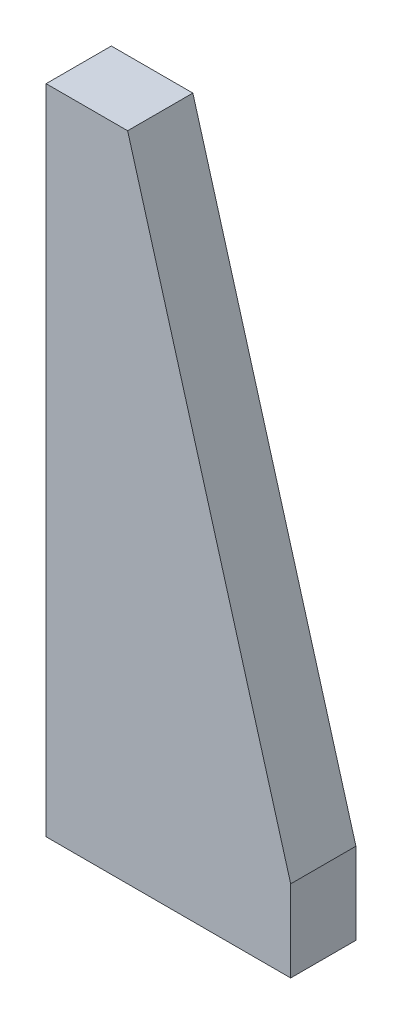
ISO-10303-21;
HEADER;
FILE_DESCRIPTION(('STEP AP214'),'2;1');
FILE_NAME('part.step','',(''),(''),'','','');
FILE_SCHEMA(('AUTOMOTIVE_DESIGN { 1 0 10303 214 1 1 1 1 }'));
ENDSEC;
DATA;
#1=APPLICATION_CONTEXT('core data for automotive mechanical design processes');
#2=APPLICATION_PROTOCOL_DEFINITION('international standard','automotive_design',2000,#1);
#3=PRODUCT_CONTEXT('',#1,'mechanical');
#4=PRODUCT('Part','Part','',(#3));
#5=PRODUCT_RELATED_PRODUCT_CATEGORY('part','',(#4));
#6=PRODUCT_DEFINITION_FORMATION('','',#4);
#7=PRODUCT_DEFINITION_CONTEXT('part definition',#1,'design');
#8=PRODUCT_DEFINITION('design','',#6,#7);
#9=PRODUCT_DEFINITION_SHAPE('','',#8);
#10=(LENGTH_UNIT() NAMED_UNIT(*) SI_UNIT(.MILLI.,.METRE.));
#11=(NAMED_UNIT(*) PLANE_ANGLE_UNIT() SI_UNIT($,.RADIAN.));
#12=(NAMED_UNIT(*) SI_UNIT($,.STERADIAN.) SOLID_ANGLE_UNIT());
#13=UNCERTAINTY_MEASURE_WITH_UNIT(LENGTH_MEASURE(1.E-05),#10,'distance_accuracy_value','');
#14=(GEOMETRIC_REPRESENTATION_CONTEXT(3) GLOBAL_UNCERTAINTY_ASSIGNED_CONTEXT((#13)) GLOBAL_UNIT_ASSIGNED_CONTEXT((#10,
#11,#12)) REPRESENTATION_CONTEXT('',''));
#15=CARTESIAN_POINT('',(0.,0.,0.));
#16=DIRECTION('',(0.,0.,1.));
#17=DIRECTION('',(1.,0.,0.));
#18=AXIS2_PLACEMENT_3D('',#15,#16,#17);
#19=CARTESIAN_POINT('',(22.,0.,0.));
#20=DIRECTION('',(0.,-1.,0.));
#21=DIRECTION('',(0.,0.,-1.));
#22=AXIS2_PLACEMENT_3D('',#19,#20,#21);
#23=CYLINDRICAL_SURFACE('',#22,1.65);
#24=DIRECTION('',(0.,-1.,0.));
#25=VECTOR('',#24,1.);
#26=CARTESIAN_POINT('',(22.,0.,1.65));
#27=LINE('',#26,#25);
#28=CARTESIAN_POINT('',(22.,10.1,1.65));
#29=VERTEX_POINT('',#28);
#30=CARTESIAN_POINT('',(22.,0.,1.65));
#31=VERTEX_POINT('',#30);
#32=EDGE_CURVE('E223',#29,#31,#27,.T.);
#33=ORIENTED_EDGE('',*,*,#32,.F.);
#34=CARTESIAN_POINT('',(22.,10.1,0.));
#35=DIRECTION('',(0.,-1.,0.));
#36=DIRECTION('',(0.,0.,-1.));
#37=AXIS2_PLACEMENT_3D('',#34,#35,#36);
#38=CIRCLE('',#37,1.65);
#39=CARTESIAN_POINT('',(22.,10.1,-1.65));
#40=VERTEX_POINT('',#39);
#41=EDGE_CURVE('E11',#40,#29,#38,.T.);
#42=ORIENTED_EDGE('',*,*,#41,.F.);
#43=DIRECTION('',(0.,-1.,0.));
#44=VECTOR('',#43,1.);
#45=CARTESIAN_POINT('',(22.,0.,-1.65));
#46=LINE('',#45,#44);
#47=CARTESIAN_POINT('',(22.,0.,-1.65));
#48=VERTEX_POINT('',#47);
#49=EDGE_CURVE('E212',#40,#48,#46,.T.);
#50=ORIENTED_EDGE('',*,*,#49,.T.);
#51=CARTESIAN_POINT('',(22.,0.,0.));
#52=DIRECTION('',(0.,-1.,0.));
#53=DIRECTION('',(0.,0.,-1.));
#54=AXIS2_PLACEMENT_3D('',#51,#52,#53);
#55=CIRCLE('',#54,1.65);
#56=EDGE_CURVE('E281',#48,#31,#55,.T.);
#57=ORIENTED_EDGE('',*,*,#56,.T.);
#58=EDGE_LOOP('',(#33,#42,#50,#57));
#59=FACE_BOUND('',#58,.T.);
#60=ADVANCED_FACE('F17',(#59),#23,.F.);
#61=CARTESIAN_POINT('',(22.,10.1,0.));
#62=DIRECTION('',(0.,-1.,0.));
#63=DIRECTION('',(0.,0.,-1.));
#64=AXIS2_PLACEMENT_3D('',#61,#62,#63);
#65=CONICAL_SURFACE('',#64,1.65,1.02974425867665);
#66=DIRECTION('',(0.,-0.515038074910059,0.85716730070211));
#67=VECTOR('',#66,1.);
#68=CARTESIAN_POINT('',(22.,10.1,1.65));
#69=LINE('',#68,#67);
#70=CARTESIAN_POINT('',(22.,11.0914200213955,0.));
#71=VERTEX_POINT('',#70);
#72=EDGE_CURVE('E211',#71,#29,#69,.T.);
#73=ORIENTED_EDGE('',*,*,#72,.F.);
#74=DIRECTION('',(0.,-0.515038074910059,-0.85716730070211));
#75=VECTOR('',#74,1.);
#76=CARTESIAN_POINT('',(22.,10.1,-1.65));
#77=LINE('',#76,#75);
#78=EDGE_CURVE('E209',#71,#40,#77,.T.);
#79=ORIENTED_EDGE('',*,*,#78,.T.);
#80=ORIENTED_EDGE('',*,*,#41,.T.);
#81=EDGE_LOOP('',(#73,#79,#80));
#82=FACE_BOUND('',#81,.T.);
#83=ADVANCED_FACE('F469',(#82),#65,.F.);
#84=CARTESIAN_POINT('',(7.,0.,0.));
#85=DIRECTION('',(0.,-1.,0.));
#86=DIRECTION('',(0.,0.,-1.));
#87=AXIS2_PLACEMENT_3D('',#84,#85,#86);
#88=CYLINDRICAL_SURFACE('',#87,1.65);
#89=DIRECTION('',(0.,-1.,0.));
#90=VECTOR('',#89,1.);
#91=CARTESIAN_POINT('',(7.,0.,1.65));
#92=LINE('',#91,#90);
#93=CARTESIAN_POINT('',(7.,10.1,1.65));
#94=VERTEX_POINT('',#93);
#95=CARTESIAN_POINT('',(7.,0.,1.65));
#96=VERTEX_POINT('',#95);
#97=EDGE_CURVE('E245',#94,#96,#92,.T.);
#98=ORIENTED_EDGE('',*,*,#97,.F.);
#99=CARTESIAN_POINT('',(7.,10.1,0.));
#100=DIRECTION('',(0.,-1.,0.));
#101=DIRECTION('',(0.,0.,-1.));
#102=AXIS2_PLACEMENT_3D('',#99,#100,#101);
#103=CIRCLE('',#102,1.65);
#104=CARTESIAN_POINT('',(7.,10.1,-1.65));
#105=VERTEX_POINT('',#104);
#106=EDGE_CURVE('E28',#105,#94,#103,.T.);
#107=ORIENTED_EDGE('',*,*,#106,.F.);
#108=DIRECTION('',(0.,-1.,0.));
#109=VECTOR('',#108,1.);
#110=CARTESIAN_POINT('',(7.,0.,-1.65));
#111=LINE('',#110,#109);
#112=CARTESIAN_POINT('',(7.,0.,-1.65));
#113=VERTEX_POINT('',#112);
#114=EDGE_CURVE('E236',#105,#113,#111,.T.);
#115=ORIENTED_EDGE('',*,*,#114,.T.);
#116=CARTESIAN_POINT('',(7.,0.,0.));
#117=DIRECTION('',(0.,-1.,0.));
#118=DIRECTION('',(0.,0.,-1.));
#119=AXIS2_PLACEMENT_3D('',#116,#117,#118);
#120=CIRCLE('',#119,1.65);
#121=EDGE_CURVE('E207',#113,#96,#120,.T.);
#122=ORIENTED_EDGE('',*,*,#121,.T.);
#123=EDGE_LOOP('',(#98,#107,#115,#122));
#124=FACE_BOUND('',#123,.T.);
#125=ADVANCED_FACE('F447',(#124),#88,.F.);
#126=CARTESIAN_POINT('',(7.,10.1,0.));
#127=DIRECTION('',(0.,-1.,0.));
#128=DIRECTION('',(0.,0.,-1.));
#129=AXIS2_PLACEMENT_3D('',#126,#127,#128);
#130=CONICAL_SURFACE('',#129,1.65,1.02974425867665);
#131=DIRECTION('',(0.,-0.515038074910059,0.85716730070211));
#132=VECTOR('',#131,1.);
#133=CARTESIAN_POINT('',(7.,10.1,1.65));
#134=LINE('',#133,#132);
#135=CARTESIAN_POINT('',(7.,11.0914200213955,0.));
#136=VERTEX_POINT('',#135);
#137=EDGE_CURVE('E246',#136,#94,#134,.T.);
#138=ORIENTED_EDGE('',*,*,#137,.F.);
#139=DIRECTION('',(0.,-0.515038074910059,-0.85716730070211));
#140=VECTOR('',#139,1.);
#141=CARTESIAN_POINT('',(7.,10.1,-1.65));
#142=LINE('',#141,#140);
#143=EDGE_CURVE('E239',#136,#105,#142,.T.);
#144=ORIENTED_EDGE('',*,*,#143,.T.);
#145=ORIENTED_EDGE('',*,*,#106,.T.);
#146=EDGE_LOOP('',(#138,#144,#145));
#147=FACE_BOUND('',#146,.T.);
#148=ADVANCED_FACE('F450',(#147),#130,.F.);
#149=CARTESIAN_POINT('',(0.,65.,0.));
#150=DIRECTION('',(-1.,0.,0.));
#151=DIRECTION('',(0.,0.,1.));
#152=AXIS2_PLACEMENT_3D('',#149,#150,#151);
#153=CYLINDRICAL_SURFACE('',#152,1.65);
#154=DIRECTION('',(-1.,0.,0.));
#155=VECTOR('',#154,1.);
#156=CARTESIAN_POINT('',(0.,65.,-1.65));
#157=LINE('',#156,#155);
#158=CARTESIAN_POINT('',(10.1,65.,-1.65));
#159=VERTEX_POINT('',#158);
#160=CARTESIAN_POINT('',(0.,65.,-1.65));
#161=VERTEX_POINT('',#160);
#162=EDGE_CURVE('E256',#159,#161,#157,.T.);
#163=ORIENTED_EDGE('',*,*,#162,.F.);
#164=CARTESIAN_POINT('',(10.1,65.,0.));
#165=DIRECTION('',(-1.,0.,0.));
#166=DIRECTION('',(0.,0.,1.));
#167=AXIS2_PLACEMENT_3D('',#164,#165,#166);
#168=CIRCLE('',#167,1.65);
#169=CARTESIAN_POINT('',(10.1,65.,1.65));
#170=VERTEX_POINT('',#169);
#171=EDGE_CURVE('E323',#170,#159,#168,.T.);
#172=ORIENTED_EDGE('',*,*,#171,.F.);
#173=DIRECTION('',(-1.,0.,0.));
#174=VECTOR('',#173,1.);
#175=CARTESIAN_POINT('',(0.,65.,1.65));
#176=LINE('',#175,#174);
#177=CARTESIAN_POINT('',(0.,65.,1.65));
#178=VERTEX_POINT('',#177);
#179=EDGE_CURVE('E255',#170,#178,#176,.T.);
#180=ORIENTED_EDGE('',*,*,#179,.T.);
#181=CARTESIAN_POINT('',(0.,65.,0.));
#182=DIRECTION('',(-1.,0.,0.));
#183=DIRECTION('',(0.,0.,1.));
#184=AXIS2_PLACEMENT_3D('',#181,#182,#183);
#185=CIRCLE('',#184,1.65);
#186=EDGE_CURVE('E311',#178,#161,#185,.T.);
#187=ORIENTED_EDGE('',*,*,#186,.T.);
#188=EDGE_LOOP('',(#163,#172,#180,#187));
#189=FACE_BOUND('',#188,.T.);
#190=ADVANCED_FACE('F19',(#189),#153,.F.);
#191=CARTESIAN_POINT('',(10.1,65.,0.));
#192=DIRECTION('',(-1.,0.,0.));
#193=DIRECTION('',(0.,0.,1.));
#194=AXIS2_PLACEMENT_3D('',#191,#192,#193);
#195=CONICAL_SURFACE('',#194,1.65,1.02974425867665);
#196=DIRECTION('',(-0.515038074910055,0.,-0.857167300702112));
#197=VECTOR('',#196,1.);
#198=CARTESIAN_POINT('',(10.1,65.,-1.65));
#199=LINE('',#198,#197);
#200=CARTESIAN_POINT('',(11.0914200213955,65.,0.));
#201=VERTEX_POINT('',#200);
#202=EDGE_CURVE('E276',#201,#159,#199,.T.);
#203=ORIENTED_EDGE('',*,*,#202,.F.);
#204=DIRECTION('',(-0.515038074910055,0.,0.857167300702112));
#205=VECTOR('',#204,1.);
#206=CARTESIAN_POINT('',(10.1,65.,1.65));
#207=LINE('',#206,#205);
#208=EDGE_CURVE('E280',#201,#170,#207,.T.);
#209=ORIENTED_EDGE('',*,*,#208,.T.);
#210=ORIENTED_EDGE('',*,*,#171,.T.);
#211=EDGE_LOOP('',(#203,#209,#210));
#212=FACE_BOUND('',#211,.T.);
#213=ADVANCED_FACE('F486',(#212),#195,.F.);
#214=CARTESIAN_POINT('',(0.,40.,0.));
#215=DIRECTION('',(-1.,0.,0.));
#216=DIRECTION('',(0.,0.,1.));
#217=AXIS2_PLACEMENT_3D('',#214,#215,#216);
#218=CYLINDRICAL_SURFACE('',#217,1.65);
#219=DIRECTION('',(-1.,0.,0.));
#220=VECTOR('',#219,1.);
#221=CARTESIAN_POINT('',(0.,40.,-1.65));
#222=LINE('',#221,#220);
#223=CARTESIAN_POINT('',(10.1,40.,-1.65));
#224=VERTEX_POINT('',#223);
#225=CARTESIAN_POINT('',(0.,40.,-1.65));
#226=VERTEX_POINT('',#225);
#227=EDGE_CURVE('E275',#224,#226,#222,.T.);
#228=ORIENTED_EDGE('',*,*,#227,.F.);
#229=CARTESIAN_POINT('',(10.1,40.,0.));
#230=DIRECTION('',(-1.,0.,0.));
#231=DIRECTION('',(0.,0.,1.));
#232=AXIS2_PLACEMENT_3D('',#229,#230,#231);
#233=CIRCLE('',#232,1.65);
#234=CARTESIAN_POINT('',(10.1,40.,1.65));
#235=VERTEX_POINT('',#234);
#236=EDGE_CURVE('E295',#235,#224,#233,.T.);
#237=ORIENTED_EDGE('',*,*,#236,.F.);
#238=DIRECTION('',(-1.,0.,0.));
#239=VECTOR('',#238,1.);
#240=CARTESIAN_POINT('',(0.,40.,1.65));
#241=LINE('',#240,#239);
#242=CARTESIAN_POINT('',(0.,40.,1.65));
#243=VERTEX_POINT('',#242);
#244=EDGE_CURVE('E342',#235,#243,#241,.T.);
#245=ORIENTED_EDGE('',*,*,#244,.T.);
#246=CARTESIAN_POINT('',(0.,40.,0.));
#247=DIRECTION('',(-1.,0.,0.));
#248=DIRECTION('',(0.,0.,1.));
#249=AXIS2_PLACEMENT_3D('',#246,#247,#248);
#250=CIRCLE('',#249,1.65);
#251=EDGE_CURVE('E308',#243,#226,#250,.T.);
#252=ORIENTED_EDGE('',*,*,#251,.T.);
#253=EDGE_LOOP('',(#228,#237,#245,#252));
#254=FACE_BOUND('',#253,.T.);
#255=ADVANCED_FACE('F399',(#254),#218,.F.);
#256=CARTESIAN_POINT('',(10.1,40.,0.));
#257=DIRECTION('',(-1.,0.,0.));
#258=DIRECTION('',(0.,0.,1.));
#259=AXIS2_PLACEMENT_3D('',#256,#257,#258);
#260=CONICAL_SURFACE('',#259,1.65,1.02974425867665);
#261=DIRECTION('',(-0.515038074910055,0.,-0.857167300702112));
#262=VECTOR('',#261,1.);
#263=CARTESIAN_POINT('',(10.1,40.,-1.65));
#264=LINE('',#263,#262);
#265=CARTESIAN_POINT('',(11.0914200213955,40.,0.));
#266=VERTEX_POINT('',#265);
#267=EDGE_CURVE('E288',#266,#224,#264,.T.);
#268=ORIENTED_EDGE('',*,*,#267,.F.);
#269=DIRECTION('',(-0.515038074910055,0.,0.857167300702112));
#270=VECTOR('',#269,1.);
#271=CARTESIAN_POINT('',(10.1,40.,1.65));
#272=LINE('',#271,#270);
#273=EDGE_CURVE('E292',#266,#235,#272,.T.);
#274=ORIENTED_EDGE('',*,*,#273,.T.);
#275=ORIENTED_EDGE('',*,*,#236,.T.);
#276=EDGE_LOOP('',(#268,#274,#275));
#277=FACE_BOUND('',#276,.T.);
#278=ADVANCED_FACE('F390',(#277),#260,.F.);
#279=CARTESIAN_POINT('',(0.,15.,0.));
#280=DIRECTION('',(-1.,0.,0.));
#281=DIRECTION('',(0.,0.,1.));
#282=AXIS2_PLACEMENT_3D('',#279,#280,#281);
#283=CYLINDRICAL_SURFACE('',#282,1.65);
#284=DIRECTION('',(-1.,0.,0.));
#285=VECTOR('',#284,1.);
#286=CARTESIAN_POINT('',(0.,15.,-1.65));
#287=LINE('',#286,#285);
#288=CARTESIAN_POINT('',(10.1,15.,-1.65));
#289=VERTEX_POINT('',#288);
#290=CARTESIAN_POINT('',(0.,15.,-1.65));
#291=VERTEX_POINT('',#290);
#292=EDGE_CURVE('E335',#289,#291,#287,.T.);
#293=ORIENTED_EDGE('',*,*,#292,.F.);
#294=CARTESIAN_POINT('',(10.1,15.,0.));
#295=DIRECTION('',(-1.,0.,0.));
#296=DIRECTION('',(0.,0.,1.));
#297=AXIS2_PLACEMENT_3D('',#294,#295,#296);
#298=CIRCLE('',#297,1.65);
#299=CARTESIAN_POINT('',(10.1,15.,1.65));
#300=VERTEX_POINT('',#299);
#301=EDGE_CURVE('E187',#300,#289,#298,.T.);
#302=ORIENTED_EDGE('',*,*,#301,.F.);
#303=DIRECTION('',(-1.,0.,0.));
#304=VECTOR('',#303,1.);
#305=CARTESIAN_POINT('',(0.,15.,1.65));
#306=LINE('',#305,#304);
#307=CARTESIAN_POINT('',(0.,15.,1.65));
#308=VERTEX_POINT('',#307);
#309=EDGE_CURVE('E21',#300,#308,#306,.T.);
#310=ORIENTED_EDGE('',*,*,#309,.T.);
#311=CARTESIAN_POINT('',(0.,15.,0.));
#312=DIRECTION('',(-1.,0.,0.));
#313=DIRECTION('',(0.,0.,1.));
#314=AXIS2_PLACEMENT_3D('',#311,#312,#313);
#315=CIRCLE('',#314,1.65);
#316=EDGE_CURVE('E173',#308,#291,#315,.T.);
#317=ORIENTED_EDGE('',*,*,#316,.T.);
#318=EDGE_LOOP('',(#293,#302,#310,#317));
#319=FACE_BOUND('',#318,.T.);
#320=ADVANCED_FACE('F500',(#319),#283,.F.);
#321=CARTESIAN_POINT('',(10.1,15.,0.));
#322=DIRECTION('',(-1.,0.,0.));
#323=DIRECTION('',(0.,0.,1.));
#324=AXIS2_PLACEMENT_3D('',#321,#322,#323);
#325=CONICAL_SURFACE('',#324,1.65,1.02974425867665);
#326=DIRECTION('',(-0.515038074910056,0.,-0.857167300702111));
#327=VECTOR('',#326,1.);
#328=CARTESIAN_POINT('',(10.1,15.,-1.65));
#329=LINE('',#328,#327);
#330=CARTESIAN_POINT('',(11.0914200213955,15.,0.));
#331=VERTEX_POINT('',#330);
#332=EDGE_CURVE('E182',#331,#289,#329,.T.);
#333=ORIENTED_EDGE('',*,*,#332,.F.);
#334=DIRECTION('',(-0.515038074910056,0.,0.857167300702111));
#335=VECTOR('',#334,1.);
#336=CARTESIAN_POINT('',(10.1,15.,1.65));
#337=LINE('',#336,#335);
#338=EDGE_CURVE('E185',#331,#300,#337,.T.);
#339=ORIENTED_EDGE('',*,*,#338,.T.);
#340=ORIENTED_EDGE('',*,*,#301,.T.);
#341=EDGE_LOOP('',(#333,#339,#340));
#342=FACE_BOUND('',#341,.T.);
#343=ADVANCED_FACE('F184',(#342),#325,.F.);
#344=CARTESIAN_POINT('',(0.,0.,-4.));
#345=DIRECTION('',(0.,0.,1.));
#346=DIRECTION('',(1.,0.,0.));
#347=AXIS2_PLACEMENT_3D('',#344,#345,#346);
#348=PLANE('',#347);
#349=DIRECTION('',(0.,-1.,0.));
#350=VECTOR('',#349,1.);
#351=CARTESIAN_POINT('',(0.,80.,-4.));
#352=LINE('',#351,#350);
#353=CARTESIAN_POINT('',(0.,80.,-4.));
#354=VERTEX_POINT('',#353);
#355=CARTESIAN_POINT('',(0.,0.,-4.));
#356=VERTEX_POINT('',#355);
#357=EDGE_CURVE('E192',#354,#356,#352,.T.);
#358=ORIENTED_EDGE('',*,*,#357,.F.);
#359=DIRECTION('',(-1.,0.,0.));
#360=VECTOR('',#359,1.);
#361=CARTESIAN_POINT('',(10.,80.,-4.));
#362=LINE('',#361,#360);
#363=CARTESIAN_POINT('',(10.,80.,-4.));
#364=VERTEX_POINT('',#363);
#365=EDGE_CURVE('E328',#364,#354,#362,.T.);
#366=ORIENTED_EDGE('',*,*,#365,.F.);
#367=DIRECTION('',(-0.274721127897378,0.961523947640823,0.));
#368=VECTOR('',#367,1.);
#369=CARTESIAN_POINT('',(30.,10.,-4.));
#370=LINE('',#369,#368);
#371=CARTESIAN_POINT('',(30.,10.,-4.));
#372=VERTEX_POINT('',#371);
#373=EDGE_CURVE('E315',#372,#364,#370,.T.);
#374=ORIENTED_EDGE('',*,*,#373,.F.);
#375=DIRECTION('',(0.,1.,0.));
#376=VECTOR('',#375,1.);
#377=CARTESIAN_POINT('',(30.,0.,-4.));
#378=LINE('',#377,#376);
#379=CARTESIAN_POINT('',(30.,0.,-4.));
#380=VERTEX_POINT('',#379);
#381=EDGE_CURVE('E369',#380,#372,#378,.T.);
#382=ORIENTED_EDGE('',*,*,#381,.F.);
#383=DIRECTION('',(1.,0.,0.));
#384=VECTOR('',#383,1.);
#385=CARTESIAN_POINT('',(0.,0.,-4.));
#386=LINE('',#385,#384);
#387=EDGE_CURVE('E260',#356,#380,#386,.T.);
#388=ORIENTED_EDGE('',*,*,#387,.F.);
#389=EDGE_LOOP('',(#358,#366,#374,#382,#388));
#390=FACE_BOUND('',#389,.T.);
#391=ADVANCED_FACE('F412',(#390),#348,.F.);
#392=CARTESIAN_POINT('',(0.,0.,4.));
#393=DIRECTION('',(0.,0.,1.));
#394=DIRECTION('',(1.,0.,0.));
#395=AXIS2_PLACEMENT_3D('',#392,#393,#394);
#396=PLANE('',#395);
#397=DIRECTION('',(0.,-1.,0.));
#398=VECTOR('',#397,1.);
#399=CARTESIAN_POINT('',(0.,80.,4.));
#400=LINE('',#399,#398);
#401=CARTESIAN_POINT('',(0.,80.,4.));
#402=VERTEX_POINT('',#401);
#403=CARTESIAN_POINT('',(0.,0.,4.));
#404=VERTEX_POINT('',#403);
#405=EDGE_CURVE('E265',#402,#404,#400,.T.);
#406=ORIENTED_EDGE('',*,*,#405,.T.);
#407=DIRECTION('',(1.,0.,0.));
#408=VECTOR('',#407,1.);
#409=CARTESIAN_POINT('',(0.,0.,4.));
#410=LINE('',#409,#408);
#411=CARTESIAN_POINT('',(30.,0.,4.));
#412=VERTEX_POINT('',#411);
#413=EDGE_CURVE('E284',#404,#412,#410,.T.);
#414=ORIENTED_EDGE('',*,*,#413,.T.);
#415=DIRECTION('',(0.,1.,0.));
#416=VECTOR('',#415,1.);
#417=CARTESIAN_POINT('',(30.,0.,4.));
#418=LINE('',#417,#416);
#419=CARTESIAN_POINT('',(30.,10.,4.));
#420=VERTEX_POINT('',#419);
#421=EDGE_CURVE('E320',#412,#420,#418,.T.);
#422=ORIENTED_EDGE('',*,*,#421,.T.);
#423=DIRECTION('',(-0.274721127897378,0.961523947640823,0.));
#424=VECTOR('',#423,1.);
#425=CARTESIAN_POINT('',(30.,10.,4.));
#426=LINE('',#425,#424);
#427=CARTESIAN_POINT('',(10.,80.,4.));
#428=VERTEX_POINT('',#427);
#429=EDGE_CURVE('E331',#420,#428,#426,.T.);
#430=ORIENTED_EDGE('',*,*,#429,.T.);
#431=DIRECTION('',(-1.,0.,0.));
#432=VECTOR('',#431,1.);
#433=CARTESIAN_POINT('',(10.,80.,4.));
#434=LINE('',#433,#432);
#435=EDGE_CURVE('E43',#428,#402,#434,.T.);
#436=ORIENTED_EDGE('',*,*,#435,.T.);
#437=EDGE_LOOP('',(#406,#414,#422,#430,#436));
#438=FACE_BOUND('',#437,.T.);
#439=ADVANCED_FACE('F419',(#438),#396,.T.);
#440=CARTESIAN_POINT('',(10.,80.,4.));
#441=DIRECTION('',(0.,-1.,0.));
#442=DIRECTION('',(0.,0.,-1.));
#443=AXIS2_PLACEMENT_3D('',#440,#441,#442);
#444=PLANE('',#443);
#445=ORIENTED_EDGE('',*,*,#365,.T.);
#446=DIRECTION('',(0.,0.,-1.));
#447=VECTOR('',#446,1.);
#448=CARTESIAN_POINT('',(0.,80.,4.));
#449=LINE('',#448,#447);
#450=EDGE_CURVE('E269',#402,#354,#449,.T.);
#451=ORIENTED_EDGE('',*,*,#450,.F.);
#452=ORIENTED_EDGE('',*,*,#435,.F.);
#453=DIRECTION('',(0.,0.,-1.));
#454=VECTOR('',#453,1.);
#455=CARTESIAN_POINT('',(10.,80.,4.));
#456=LINE('',#455,#454);
#457=EDGE_CURVE('E319',#428,#364,#456,.T.);
#458=ORIENTED_EDGE('',*,*,#457,.T.);
#459=EDGE_LOOP('',(#445,#451,#452,#458));
#460=FACE_BOUND('',#459,.T.);
#461=ADVANCED_FACE('F421',(#460),#444,.F.);
#462=CARTESIAN_POINT('',(30.,10.,4.));
#463=DIRECTION('',(-0.961523947640823,-0.274721127897378,0.));
#464=DIRECTION('',(-0.274721127897378,0.961523947640823,0.));
#465=AXIS2_PLACEMENT_3D('',#462,#463,#464);
#466=PLANE('',#465);
#467=ORIENTED_EDGE('',*,*,#373,.T.);
#468=ORIENTED_EDGE('',*,*,#457,.F.);
#469=ORIENTED_EDGE('',*,*,#429,.F.);
#470=DIRECTION('',(0.,0.,-1.));
#471=VECTOR('',#470,1.);
#472=CARTESIAN_POINT('',(30.,10.,4.));
#473=LINE('',#472,#471);
#474=EDGE_CURVE('E327',#420,#372,#473,.T.);
#475=ORIENTED_EDGE('',*,*,#474,.T.);
#476=EDGE_LOOP('',(#467,#468,#469,#475));
#477=FACE_BOUND('',#476,.T.);
#478=ADVANCED_FACE('F423',(#477),#466,.F.);
#479=CARTESIAN_POINT('',(30.,0.,4.));
#480=DIRECTION('',(-1.,0.,0.));
#481=DIRECTION('',(0.,0.,1.));
#482=AXIS2_PLACEMENT_3D('',#479,#480,#481);
#483=PLANE('',#482);
#484=ORIENTED_EDGE('',*,*,#381,.T.);
#485=ORIENTED_EDGE('',*,*,#474,.F.);
#486=ORIENTED_EDGE('',*,*,#421,.F.);
#487=DIRECTION('',(0.,0.,-1.));
#488=VECTOR('',#487,1.);
#489=CARTESIAN_POINT('',(30.,0.,4.));
#490=LINE('',#489,#488);
#491=EDGE_CURVE('E264',#412,#380,#490,.T.);
#492=ORIENTED_EDGE('',*,*,#491,.T.);
#493=EDGE_LOOP('',(#484,#485,#486,#492));
#494=FACE_BOUND('',#493,.T.);
#495=ADVANCED_FACE('F426',(#494),#483,.F.);
#496=CARTESIAN_POINT('',(0.,0.,4.));
#497=DIRECTION('',(0.,1.,0.));
#498=DIRECTION('',(1.,0.,0.));
#499=AXIS2_PLACEMENT_3D('',#496,#497,#498);
#500=PLANE('',#499);
#501=ORIENTED_EDGE('',*,*,#121,.F.);
#502=CARTESIAN_POINT('',(7.,0.,0.));
#503=DIRECTION('',(0.,-1.,0.));
#504=DIRECTION('',(0.,0.,-1.));
#505=AXIS2_PLACEMENT_3D('',#502,#503,#504);
#506=CIRCLE('',#505,1.65);
#507=EDGE_CURVE('E240',#96,#113,#506,.T.);
#508=ORIENTED_EDGE('',*,*,#507,.F.);
#509=EDGE_LOOP('',(#501,#508));
#510=FACE_BOUND('',#509,.T.);
#511=ORIENTED_EDGE('',*,*,#56,.F.);
#512=CARTESIAN_POINT('',(22.,0.,0.));
#513=DIRECTION('',(0.,-1.,0.));
#514=DIRECTION('',(0.,0.,-1.));
#515=AXIS2_PLACEMENT_3D('',#512,#513,#514);
#516=CIRCLE('',#515,1.65);
#517=EDGE_CURVE('E215',#31,#48,#516,.T.);
#518=ORIENTED_EDGE('',*,*,#517,.F.);
#519=EDGE_LOOP('',(#511,#518));
#520=FACE_BOUND('',#519,.T.);
#521=ORIENTED_EDGE('',*,*,#387,.T.);
#522=ORIENTED_EDGE('',*,*,#491,.F.);
#523=ORIENTED_EDGE('',*,*,#413,.F.);
#524=DIRECTION('',(0.,0.,-1.));
#525=VECTOR('',#524,1.);
#526=CARTESIAN_POINT('',(0.,0.,4.));
#527=LINE('',#526,#525);
#528=EDGE_CURVE('E270',#404,#356,#527,.T.);
#529=ORIENTED_EDGE('',*,*,#528,.T.);
#530=EDGE_LOOP('',(#521,#522,#523,#529));
#531=FACE_BOUND('',#530,.T.);
#532=ADVANCED_FACE('F404',(#510,#520,#531),#500,.F.);
#533=CARTESIAN_POINT('',(0.,80.,4.));
#534=DIRECTION('',(1.,0.,0.));
#535=DIRECTION('',(0.,1.,0.));
#536=AXIS2_PLACEMENT_3D('',#533,#534,#535);
#537=PLANE('',#536);
#538=ORIENTED_EDGE('',*,*,#316,.F.);
#539=CARTESIAN_POINT('',(0.,15.,0.));
#540=DIRECTION('',(-1.,0.,0.));
#541=DIRECTION('',(0.,0.,1.));
#542=AXIS2_PLACEMENT_3D('',#539,#540,#541);
#543=CIRCLE('',#542,1.65);
#544=EDGE_CURVE('E204',#291,#308,#543,.T.);
#545=ORIENTED_EDGE('',*,*,#544,.F.);
#546=EDGE_LOOP('',(#538,#545));
#547=FACE_BOUND('',#546,.T.);
#548=ORIENTED_EDGE('',*,*,#251,.F.);
#549=CARTESIAN_POINT('',(0.,40.,0.));
#550=DIRECTION('',(-1.,0.,0.));
#551=DIRECTION('',(0.,0.,1.));
#552=AXIS2_PLACEMENT_3D('',#549,#550,#551);
#553=CIRCLE('',#552,1.65);
#554=EDGE_CURVE('E338',#226,#243,#553,.T.);
#555=ORIENTED_EDGE('',*,*,#554,.F.);
#556=EDGE_LOOP('',(#548,#555));
#557=FACE_BOUND('',#556,.T.);
#558=ORIENTED_EDGE('',*,*,#186,.F.);
#559=CARTESIAN_POINT('',(0.,65.,0.));
#560=DIRECTION('',(-1.,0.,0.));
#561=DIRECTION('',(0.,0.,1.));
#562=AXIS2_PLACEMENT_3D('',#559,#560,#561);
#563=CIRCLE('',#562,1.65);
#564=EDGE_CURVE('E251',#161,#178,#563,.T.);
#565=ORIENTED_EDGE('',*,*,#564,.F.);
#566=EDGE_LOOP('',(#558,#565));
#567=FACE_BOUND('',#566,.T.);
#568=ORIENTED_EDGE('',*,*,#357,.T.);
#569=ORIENTED_EDGE('',*,*,#528,.F.);
#570=ORIENTED_EDGE('',*,*,#405,.F.);
#571=ORIENTED_EDGE('',*,*,#450,.T.);
#572=EDGE_LOOP('',(#568,#569,#570,#571));
#573=FACE_BOUND('',#572,.T.);
#574=ADVANCED_FACE('F401',(#547,#557,#567,#573),#537,.F.);
#575=CARTESIAN_POINT('',(10.1,15.,0.));
#576=DIRECTION('',(-1.,0.,0.));
#577=DIRECTION('',(0.,0.,1.));
#578=AXIS2_PLACEMENT_3D('',#575,#576,#577);
#579=CONICAL_SURFACE('',#578,1.65,1.02974425867665);
#580=ORIENTED_EDGE('',*,*,#338,.F.);
#581=ORIENTED_EDGE('',*,*,#332,.T.);
#582=CARTESIAN_POINT('',(10.1,15.,0.));
#583=DIRECTION('',(-1.,0.,0.));
#584=DIRECTION('',(0.,0.,1.));
#585=AXIS2_PLACEMENT_3D('',#582,#583,#584);
#586=CIRCLE('',#585,1.65);
#587=EDGE_CURVE('E196',#289,#300,#586,.T.);
#588=ORIENTED_EDGE('',*,*,#587,.T.);
#589=EDGE_LOOP('',(#580,#581,#588));
#590=FACE_BOUND('',#589,.T.);
#591=ADVANCED_FACE('F194',(#590),#579,.F.);
#592=CARTESIAN_POINT('',(0.,15.,0.));
#593=DIRECTION('',(-1.,0.,0.));
#594=DIRECTION('',(0.,0.,1.));
#595=AXIS2_PLACEMENT_3D('',#592,#593,#594);
#596=CYLINDRICAL_SURFACE('',#595,1.65);
#597=ORIENTED_EDGE('',*,*,#587,.F.);
#598=ORIENTED_EDGE('',*,*,#292,.T.);
#599=ORIENTED_EDGE('',*,*,#544,.T.);
#600=ORIENTED_EDGE('',*,*,#309,.F.);
#601=EDGE_LOOP('',(#597,#598,#599,#600));
#602=FACE_BOUND('',#601,.T.);
#603=ADVANCED_FACE('F488',(#602),#596,.F.);
#604=CARTESIAN_POINT('',(10.1,40.,0.));
#605=DIRECTION('',(-1.,0.,0.));
#606=DIRECTION('',(0.,0.,1.));
#607=AXIS2_PLACEMENT_3D('',#604,#605,#606);
#608=CONICAL_SURFACE('',#607,1.65,1.02974425867665);
#609=ORIENTED_EDGE('',*,*,#273,.F.);
#610=ORIENTED_EDGE('',*,*,#267,.T.);
#611=CARTESIAN_POINT('',(10.1,40.,0.));
#612=DIRECTION('',(-1.,0.,0.));
#613=DIRECTION('',(0.,0.,1.));
#614=AXIS2_PLACEMENT_3D('',#611,#612,#613);
#615=CIRCLE('',#614,1.65);
#616=EDGE_CURVE('E271',#224,#235,#615,.T.);
#617=ORIENTED_EDGE('',*,*,#616,.T.);
#618=EDGE_LOOP('',(#609,#610,#617));
#619=FACE_BOUND('',#618,.T.);
#620=ADVANCED_FACE('F397',(#619),#608,.F.);
#621=CARTESIAN_POINT('',(0.,40.,0.));
#622=DIRECTION('',(-1.,0.,0.));
#623=DIRECTION('',(0.,0.,1.));
#624=AXIS2_PLACEMENT_3D('',#621,#622,#623);
#625=CYLINDRICAL_SURFACE('',#624,1.65);
#626=ORIENTED_EDGE('',*,*,#616,.F.);
#627=ORIENTED_EDGE('',*,*,#227,.T.);
#628=ORIENTED_EDGE('',*,*,#554,.T.);
#629=ORIENTED_EDGE('',*,*,#244,.F.);
#630=EDGE_LOOP('',(#626,#627,#628,#629));
#631=FACE_BOUND('',#630,.T.);
#632=ADVANCED_FACE('F394',(#631),#625,.F.);
#633=CARTESIAN_POINT('',(10.1,65.,0.));
#634=DIRECTION('',(-1.,0.,0.));
#635=DIRECTION('',(0.,0.,1.));
#636=AXIS2_PLACEMENT_3D('',#633,#634,#635);
#637=CONICAL_SURFACE('',#636,1.65,1.02974425867665);
#638=ORIENTED_EDGE('',*,*,#208,.F.);
#639=ORIENTED_EDGE('',*,*,#202,.T.);
#640=CARTESIAN_POINT('',(10.1,65.,0.));
#641=DIRECTION('',(-1.,0.,0.));
#642=DIRECTION('',(0.,0.,1.));
#643=AXIS2_PLACEMENT_3D('',#640,#641,#642);
#644=CIRCLE('',#643,1.65);
#645=EDGE_CURVE('E250',#159,#170,#644,.T.);
#646=ORIENTED_EDGE('',*,*,#645,.T.);
#647=EDGE_LOOP('',(#638,#639,#646));
#648=FACE_BOUND('',#647,.T.);
#649=ADVANCED_FACE('F463',(#648),#637,.F.);
#650=CARTESIAN_POINT('',(0.,65.,0.));
#651=DIRECTION('',(-1.,0.,0.));
#652=DIRECTION('',(0.,0.,1.));
#653=AXIS2_PLACEMENT_3D('',#650,#651,#652);
#654=CYLINDRICAL_SURFACE('',#653,1.65);
#655=ORIENTED_EDGE('',*,*,#645,.F.);
#656=ORIENTED_EDGE('',*,*,#162,.T.);
#657=ORIENTED_EDGE('',*,*,#564,.T.);
#658=ORIENTED_EDGE('',*,*,#179,.F.);
#659=EDGE_LOOP('',(#655,#656,#657,#658));
#660=FACE_BOUND('',#659,.T.);
#661=ADVANCED_FACE('F454',(#660),#654,.F.);
#662=CARTESIAN_POINT('',(7.,10.1,0.));
#663=DIRECTION('',(0.,-1.,0.));
#664=DIRECTION('',(0.,0.,-1.));
#665=AXIS2_PLACEMENT_3D('',#662,#663,#664);
#666=CONICAL_SURFACE('',#665,1.65,1.02974425867665);
#667=ORIENTED_EDGE('',*,*,#143,.F.);
#668=ORIENTED_EDGE('',*,*,#137,.T.);
#669=CARTESIAN_POINT('',(7.,10.1,0.));
#670=DIRECTION('',(0.,-1.,0.));
#671=DIRECTION('',(0.,0.,-1.));
#672=AXIS2_PLACEMENT_3D('',#669,#670,#671);
#673=CIRCLE('',#672,1.65);
#674=EDGE_CURVE('E241',#94,#105,#673,.T.);
#675=ORIENTED_EDGE('',*,*,#674,.T.);
#676=EDGE_LOOP('',(#667,#668,#675));
#677=FACE_BOUND('',#676,.T.);
#678=ADVANCED_FACE('F452',(#677),#666,.F.);
#679=CARTESIAN_POINT('',(7.,0.,0.));
#680=DIRECTION('',(0.,-1.,0.));
#681=DIRECTION('',(0.,0.,-1.));
#682=AXIS2_PLACEMENT_3D('',#679,#680,#681);
#683=CYLINDRICAL_SURFACE('',#682,1.65);
#684=ORIENTED_EDGE('',*,*,#674,.F.);
#685=ORIENTED_EDGE('',*,*,#97,.T.);
#686=ORIENTED_EDGE('',*,*,#507,.T.);
#687=ORIENTED_EDGE('',*,*,#114,.F.);
#688=EDGE_LOOP('',(#684,#685,#686,#687));
#689=FACE_BOUND('',#688,.T.);
#690=ADVANCED_FACE('F442',(#689),#683,.F.);
#691=CARTESIAN_POINT('',(22.,10.1,0.));
#692=DIRECTION('',(0.,-1.,0.));
#693=DIRECTION('',(0.,0.,-1.));
#694=AXIS2_PLACEMENT_3D('',#691,#692,#693);
#695=CONICAL_SURFACE('',#694,1.65,1.02974425867665);
#696=ORIENTED_EDGE('',*,*,#78,.F.);
#697=ORIENTED_EDGE('',*,*,#72,.T.);
#698=CARTESIAN_POINT('',(22.,10.1,0.));
#699=DIRECTION('',(0.,-1.,0.));
#700=DIRECTION('',(0.,0.,-1.));
#701=AXIS2_PLACEMENT_3D('',#698,#699,#700);
#702=CIRCLE('',#701,1.65);
#703=EDGE_CURVE('E232',#29,#40,#702,.T.);
#704=ORIENTED_EDGE('',*,*,#703,.T.);
#705=EDGE_LOOP('',(#696,#697,#704));
#706=FACE_BOUND('',#705,.T.);
#707=ADVANCED_FACE('F461',(#706),#695,.F.);
#708=CARTESIAN_POINT('',(22.,0.,0.));
#709=DIRECTION('',(0.,-1.,0.));
#710=DIRECTION('',(0.,0.,-1.));
#711=AXIS2_PLACEMENT_3D('',#708,#709,#710);
#712=CYLINDRICAL_SURFACE('',#711,1.65);
#713=ORIENTED_EDGE('',*,*,#703,.F.);
#714=ORIENTED_EDGE('',*,*,#32,.T.);
#715=ORIENTED_EDGE('',*,*,#517,.T.);
#716=ORIENTED_EDGE('',*,*,#49,.F.);
#717=EDGE_LOOP('',(#713,#714,#715,#716));
#718=FACE_BOUND('',#717,.T.);
#719=ADVANCED_FACE('F494',(#718),#712,.F.);
#720=CLOSED_SHELL('',(#60,#83,#125,#148,#190,#213,#255,#278,#320,#343,#391,#439,#461,#478,#495,
#532,#574,#591,#603,#620,#632,#649,#661,#678,#690,#707,#719));
#721=MANIFOLD_SOLID_BREP('B1',#720);
#722=ADVANCED_BREP_SHAPE_REPRESENTATION('',(#18,#721),#14);
#723=SHAPE_DEFINITION_REPRESENTATION(#9,#722);
ENDSEC;
END-ISO-10303-21;
